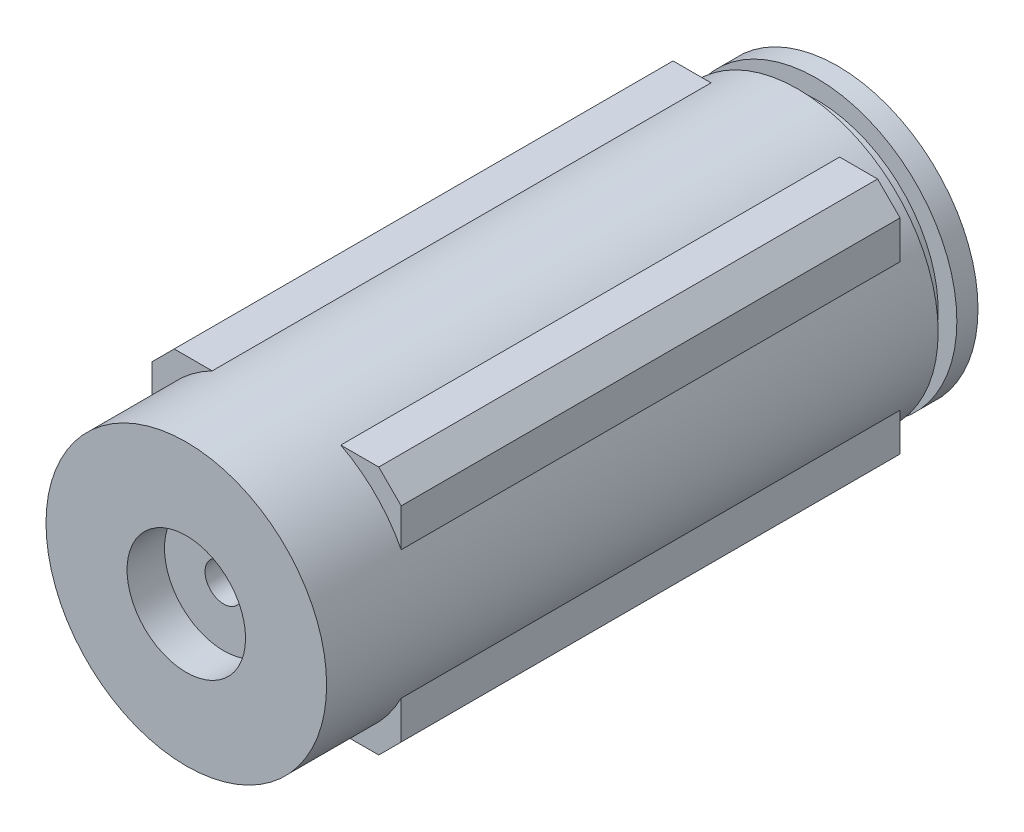
ISO-10303-21;
HEADER;
FILE_DESCRIPTION(('STEP AP214'),'2;1');
FILE_NAME('part.step','',(''),(''),'','','');
FILE_SCHEMA(('AUTOMOTIVE_DESIGN { 1 0 10303 214 1 1 1 1 }'));
ENDSEC;
DATA;
#1=APPLICATION_CONTEXT('core data for automotive mechanical design processes');
#2=APPLICATION_PROTOCOL_DEFINITION('international standard','automotive_design',2000,#1);
#3=PRODUCT_CONTEXT('',#1,'mechanical');
#4=PRODUCT('Part','Part','',(#3));
#5=PRODUCT_RELATED_PRODUCT_CATEGORY('part','',(#4));
#6=PRODUCT_DEFINITION_FORMATION('','',#4);
#7=PRODUCT_DEFINITION_CONTEXT('part definition',#1,'design');
#8=PRODUCT_DEFINITION('design','',#6,#7);
#9=PRODUCT_DEFINITION_SHAPE('','',#8);
#10=(LENGTH_UNIT() NAMED_UNIT(*) SI_UNIT(.MILLI.,.METRE.));
#11=(NAMED_UNIT(*) PLANE_ANGLE_UNIT() SI_UNIT($,.RADIAN.));
#12=(NAMED_UNIT(*) SI_UNIT($,.STERADIAN.) SOLID_ANGLE_UNIT());
#13=UNCERTAINTY_MEASURE_WITH_UNIT(LENGTH_MEASURE(1.E-05),#10,'distance_accuracy_value','');
#14=(GEOMETRIC_REPRESENTATION_CONTEXT(3) GLOBAL_UNCERTAINTY_ASSIGNED_CONTEXT((#13)) GLOBAL_UNIT_ASSIGNED_CONTEXT((#10,
#11,#12)) REPRESENTATION_CONTEXT('',''));
#15=CARTESIAN_POINT('',(0.,0.,0.));
#16=DIRECTION('',(0.,0.,1.));
#17=DIRECTION('',(1.,0.,0.));
#18=AXIS2_PLACEMENT_3D('',#15,#16,#17);
#19=CARTESIAN_POINT('',(0.,0.,90.));
#20=DIRECTION('',(0.,0.,-1.));
#21=DIRECTION('',(-1.,0.,0.));
#22=AXIS2_PLACEMENT_3D('',#19,#20,#21);
#23=CYLINDRICAL_SURFACE('',#22,3.);
#24=CARTESIAN_POINT('',(0.,0.,-4.));
#25=DIRECTION('',(0.,0.,-1.));
#26=DIRECTION('',(-1.,0.,0.));
#27=AXIS2_PLACEMENT_3D('',#24,#25,#26);
#28=CIRCLE('',#27,3.);
#29=CARTESIAN_POINT('',(-3.,0.,-4.));
#30=VERTEX_POINT('',#29);
#31=EDGE_CURVE('E229',#30,#30,#28,.F.);
#32=ORIENTED_EDGE('',*,*,#31,.F.);
#33=EDGE_LOOP('',(#32));
#34=FACE_BOUND('',#33,.T.);
#35=CARTESIAN_POINT('',(0.,0.,88.46));
#36=DIRECTION('',(0.,0.,1.));
#37=DIRECTION('',(1.,0.,0.));
#38=AXIS2_PLACEMENT_3D('',#35,#36,#37);
#39=CIRCLE('',#38,3.);
#40=CARTESIAN_POINT('',(3.,0.,88.46));
#41=VERTEX_POINT('',#40);
#42=EDGE_CURVE('E39',#41,#41,#39,.F.);
#43=ORIENTED_EDGE('',*,*,#42,.F.);
#44=EDGE_LOOP('',(#43));
#45=FACE_BOUND('',#44,.T.);
#46=ADVANCED_FACE('F35',(#34,#45),#23,.F.);
#47=CARTESIAN_POINT('',(0.,0.,80.));
#48=DIRECTION('',(0.,0.,-1.));
#49=DIRECTION('',(-1.,0.,0.));
#50=AXIS2_PLACEMENT_3D('',#47,#48,#49);
#51=CYLINDRICAL_SURFACE('',#50,22.5);
#52=DIRECTION('',(0.,0.,-1.));
#53=VECTOR('',#52,1.);
#54=CARTESIAN_POINT('',(-10.3077640640442,20.,80.));
#55=LINE('',#54,#53);
#56=CARTESIAN_POINT('',(-10.3077640640442,20.,80.));
#57=VERTEX_POINT('',#56);
#58=CARTESIAN_POINT('',(-10.3077640640442,20.,0.));
#59=VERTEX_POINT('',#58);
#60=EDGE_CURVE('E226',#57,#59,#55,.T.);
#61=ORIENTED_EDGE('',*,*,#60,.F.);
#62=CARTESIAN_POINT('',(0.,0.,80.));
#63=DIRECTION('',(0.,0.,1.));
#64=DIRECTION('',(1.,0.,0.));
#65=AXIS2_PLACEMENT_3D('',#62,#63,#64);
#66=CIRCLE('',#65,22.5);
#67=CARTESIAN_POINT('',(-20.,10.3077640640441,80.));
#68=VERTEX_POINT('',#67);
#69=EDGE_CURVE('E11',#57,#68,#66,.T.);
#70=ORIENTED_EDGE('',*,*,#69,.T.);
#71=DIRECTION('',(0.,0.,-1.));
#72=VECTOR('',#71,1.);
#73=CARTESIAN_POINT('',(-20.,10.3077640640441,80.));
#74=LINE('',#73,#72);
#75=CARTESIAN_POINT('',(-20.,10.3077640640441,0.));
#76=VERTEX_POINT('',#75);
#77=EDGE_CURVE('E218',#68,#76,#74,.T.);
#78=ORIENTED_EDGE('',*,*,#77,.T.);
#79=CARTESIAN_POINT('',(0.,0.,0.));
#80=DIRECTION('',(0.,0.,-1.));
#81=DIRECTION('',(-1.,0.,0.));
#82=AXIS2_PLACEMENT_3D('',#79,#80,#81);
#83=CIRCLE('',#82,22.5);
#84=EDGE_CURVE('E259',#76,#59,#83,.T.);
#85=ORIENTED_EDGE('',*,*,#84,.T.);
#86=EDGE_LOOP('',(#61,#70,#78,#85));
#87=FACE_BOUND('',#86,.T.);
#88=DIRECTION('',(0.,0.,-1.));
#89=VECTOR('',#88,1.);
#90=CARTESIAN_POINT('',(-20.,-10.3077640640442,80.));
#91=LINE('',#90,#89);
#92=CARTESIAN_POINT('',(-20.,-10.3077640640442,80.));
#93=VERTEX_POINT('',#92);
#94=CARTESIAN_POINT('',(-20.,-10.3077640640442,0.));
#95=VERTEX_POINT('',#94);
#96=EDGE_CURVE('E215',#93,#95,#91,.T.);
#97=ORIENTED_EDGE('',*,*,#96,.F.);
#98=CARTESIAN_POINT('',(-10.3077640640441,-20.,80.));
#99=VERTEX_POINT('',#98);
#100=EDGE_CURVE('E45',#93,#99,#66,.T.);
#101=ORIENTED_EDGE('',*,*,#100,.T.);
#102=DIRECTION('',(0.,0.,-1.));
#103=VECTOR('',#102,1.);
#104=CARTESIAN_POINT('',(-10.3077640640441,-20.,80.));
#105=LINE('',#104,#103);
#106=CARTESIAN_POINT('',(-10.3077640640442,-20.,0.));
#107=VERTEX_POINT('',#106);
#108=EDGE_CURVE('E206',#99,#107,#105,.T.);
#109=ORIENTED_EDGE('',*,*,#108,.T.);
#110=EDGE_CURVE('E228',#107,#95,#83,.T.);
#111=ORIENTED_EDGE('',*,*,#110,.T.);
#112=EDGE_LOOP('',(#97,#101,#109,#111));
#113=FACE_BOUND('',#112,.T.);
#114=DIRECTION('',(0.,0.,-1.));
#115=VECTOR('',#114,1.);
#116=CARTESIAN_POINT('',(10.3077640640441,-20.,80.));
#117=LINE('',#116,#115);
#118=CARTESIAN_POINT('',(10.3077640640441,-20.,80.));
#119=VERTEX_POINT('',#118);
#120=CARTESIAN_POINT('',(10.3077640640442,-20.,0.));
#121=VERTEX_POINT('',#120);
#122=EDGE_CURVE('E203',#119,#121,#117,.T.);
#123=ORIENTED_EDGE('',*,*,#122,.F.);
#124=CARTESIAN_POINT('',(20.,-10.3077640640442,80.));
#125=VERTEX_POINT('',#124);
#126=EDGE_CURVE('E261',#119,#125,#66,.T.);
#127=ORIENTED_EDGE('',*,*,#126,.T.);
#128=DIRECTION('',(0.,0.,-1.));
#129=VECTOR('',#128,1.);
#130=CARTESIAN_POINT('',(20.,-10.3077640640442,80.));
#131=LINE('',#130,#129);
#132=CARTESIAN_POINT('',(20.,-10.3077640640442,0.));
#133=VERTEX_POINT('',#132);
#134=EDGE_CURVE('E195',#125,#133,#131,.T.);
#135=ORIENTED_EDGE('',*,*,#134,.T.);
#136=EDGE_CURVE('E301',#133,#121,#83,.T.);
#137=ORIENTED_EDGE('',*,*,#136,.T.);
#138=EDGE_LOOP('',(#123,#127,#135,#137));
#139=FACE_BOUND('',#138,.T.);
#140=CARTESIAN_POINT('',(20.,10.3077640640442,80.));
#141=VERTEX_POINT('',#140);
#142=CARTESIAN_POINT('',(10.3077640640442,20.,80.));
#143=VERTEX_POINT('',#142);
#144=EDGE_CURVE('E47',#141,#143,#66,.T.);
#145=ORIENTED_EDGE('',*,*,#144,.T.);
#146=DIRECTION('',(0.,0.,-1.));
#147=VECTOR('',#146,1.);
#148=CARTESIAN_POINT('',(10.3077640640442,20.,80.));
#149=LINE('',#148,#147);
#150=CARTESIAN_POINT('',(10.3077640640442,20.,0.));
#151=VERTEX_POINT('',#150);
#152=EDGE_CURVE('E55',#143,#151,#149,.T.);
#153=ORIENTED_EDGE('',*,*,#152,.T.);
#154=CARTESIAN_POINT('',(20.,10.3077640640442,0.));
#155=VERTEX_POINT('',#154);
#156=EDGE_CURVE('E266',#151,#155,#83,.T.);
#157=ORIENTED_EDGE('',*,*,#156,.T.);
#158=DIRECTION('',(0.,0.,-1.));
#159=VECTOR('',#158,1.);
#160=CARTESIAN_POINT('',(20.,10.3077640640442,80.));
#161=LINE('',#160,#159);
#162=EDGE_CURVE('E145',#141,#155,#161,.T.);
#163=ORIENTED_EDGE('',*,*,#162,.F.);
#164=EDGE_LOOP('',(#145,#153,#157,#163));
#165=FACE_BOUND('',#164,.T.);
#166=CARTESIAN_POINT('',(0.,0.,94.46));
#167=DIRECTION('',(0.,0.,1.));
#168=DIRECTION('',(1.,0.,0.));
#169=AXIS2_PLACEMENT_3D('',#166,#167,#168);
#170=CIRCLE('',#169,22.5);
#171=CARTESIAN_POINT('',(22.5,0.,94.46));
#172=VERTEX_POINT('',#171);
#173=EDGE_CURVE('E257',#172,#172,#170,.T.);
#174=ORIENTED_EDGE('',*,*,#173,.F.);
#175=EDGE_LOOP('',(#174));
#176=FACE_BOUND('',#175,.T.);
#177=CARTESIAN_POINT('',(0.,0.,-3.61));
#178=DIRECTION('',(0.,0.,-1.));
#179=DIRECTION('',(-1.,0.,0.));
#180=AXIS2_PLACEMENT_3D('',#177,#178,#179);
#181=CIRCLE('',#180,22.5);
#182=CARTESIAN_POINT('',(-22.5,0.,-3.61));
#183=VERTEX_POINT('',#182);
#184=EDGE_CURVE('E252',#183,#183,#181,.T.);
#185=ORIENTED_EDGE('',*,*,#184,.F.);
#186=EDGE_LOOP('',(#185));
#187=FACE_BOUND('',#186,.T.);
#188=ADVANCED_FACE('F294',(#87,#113,#139,#165,#176,#187),#51,.T.);
#189=CARTESIAN_POINT('',(0.,0.,80.));
#190=DIRECTION('',(0.,0.,1.));
#191=DIRECTION('',(1.,0.,0.));
#192=AXIS2_PLACEMENT_3D('',#189,#190,#191);
#193=PLANE('',#192);
#194=ORIENTED_EDGE('',*,*,#144,.F.);
#195=DIRECTION('',(0.,-1.,0.));
#196=VECTOR('',#195,1.);
#197=CARTESIAN_POINT('',(20.,16.4,80.));
#198=LINE('',#197,#196);
#199=CARTESIAN_POINT('',(20.,16.4,80.));
#200=VERTEX_POINT('',#199);
#201=EDGE_CURVE('E140',#200,#141,#198,.T.);
#202=ORIENTED_EDGE('',*,*,#201,.F.);
#203=DIRECTION('',(0.707106781186548,-0.707106781186547,0.));
#204=VECTOR('',#203,1.);
#205=CARTESIAN_POINT('',(16.4,20.,80.));
#206=LINE('',#205,#204);
#207=CARTESIAN_POINT('',(16.4,20.,80.));
#208=VERTEX_POINT('',#207);
#209=EDGE_CURVE('E151',#208,#200,#206,.T.);
#210=ORIENTED_EDGE('',*,*,#209,.F.);
#211=DIRECTION('',(1.,0.,0.));
#212=VECTOR('',#211,1.);
#213=CARTESIAN_POINT('',(10.3077640640442,20.,80.));
#214=LINE('',#213,#212);
#215=EDGE_CURVE('E156',#143,#208,#214,.T.);
#216=ORIENTED_EDGE('',*,*,#215,.F.);
#217=EDGE_LOOP('',(#194,#202,#210,#216));
#218=FACE_BOUND('',#217,.T.);
#219=ADVANCED_FACE('F150',(#218),#193,.T.);
#220=ORIENTED_EDGE('',*,*,#69,.F.);
#221=DIRECTION('',(1.,0.,0.));
#222=VECTOR('',#221,1.);
#223=CARTESIAN_POINT('',(-16.4,20.,80.));
#224=LINE('',#223,#222);
#225=CARTESIAN_POINT('',(-16.4,20.,80.));
#226=VERTEX_POINT('',#225);
#227=EDGE_CURVE('E191',#226,#57,#224,.T.);
#228=ORIENTED_EDGE('',*,*,#227,.F.);
#229=DIRECTION('',(-0.707106781186547,-0.707106781186548,0.));
#230=VECTOR('',#229,1.);
#231=CARTESIAN_POINT('',(-16.4,20.,80.));
#232=LINE('',#231,#230);
#233=CARTESIAN_POINT('',(-20.,16.4,80.));
#234=VERTEX_POINT('',#233);
#235=EDGE_CURVE('E269',#226,#234,#232,.T.);
#236=ORIENTED_EDGE('',*,*,#235,.T.);
#237=DIRECTION('',(0.,-1.,0.));
#238=VECTOR('',#237,1.);
#239=CARTESIAN_POINT('',(-20.,16.4,80.));
#240=LINE('',#239,#238);
#241=EDGE_CURVE('E271',#234,#68,#240,.T.);
#242=ORIENTED_EDGE('',*,*,#241,.T.);
#243=EDGE_LOOP('',(#220,#228,#236,#242));
#244=FACE_BOUND('',#243,.T.);
#245=ADVANCED_FACE('F330',(#244),#193,.T.);
#246=ORIENTED_EDGE('',*,*,#100,.F.);
#247=DIRECTION('',(0.,-1.,0.));
#248=VECTOR('',#247,1.);
#249=CARTESIAN_POINT('',(-20.,-10.3077640640442,80.));
#250=LINE('',#249,#248);
#251=CARTESIAN_POINT('',(-20.,-16.4,80.));
#252=VERTEX_POINT('',#251);
#253=EDGE_CURVE('E273',#93,#252,#250,.T.);
#254=ORIENTED_EDGE('',*,*,#253,.T.);
#255=DIRECTION('',(0.707106781186548,-0.707106781186547,0.));
#256=VECTOR('',#255,1.);
#257=CARTESIAN_POINT('',(-20.,-16.4,80.));
#258=LINE('',#257,#256);
#259=CARTESIAN_POINT('',(-16.4,-20.,80.));
#260=VERTEX_POINT('',#259);
#261=EDGE_CURVE('E275',#252,#260,#258,.T.);
#262=ORIENTED_EDGE('',*,*,#261,.T.);
#263=DIRECTION('',(1.,0.,0.));
#264=VECTOR('',#263,1.);
#265=CARTESIAN_POINT('',(-16.4,-20.,80.));
#266=LINE('',#265,#264);
#267=EDGE_CURVE('E277',#260,#99,#266,.T.);
#268=ORIENTED_EDGE('',*,*,#267,.T.);
#269=EDGE_LOOP('',(#246,#254,#262,#268));
#270=FACE_BOUND('',#269,.T.);
#271=ADVANCED_FACE('F327',(#270),#193,.T.);
#272=CARTESIAN_POINT('',(0.,0.,0.));
#273=DIRECTION('',(0.,0.,1.));
#274=DIRECTION('',(1.,0.,0.));
#275=AXIS2_PLACEMENT_3D('',#272,#273,#274);
#276=PLANE('',#275);
#277=ORIENTED_EDGE('',*,*,#84,.F.);
#278=DIRECTION('',(0.,-1.,0.));
#279=VECTOR('',#278,1.);
#280=CARTESIAN_POINT('',(-20.,16.4,0.));
#281=LINE('',#280,#279);
#282=CARTESIAN_POINT('',(-20.,16.4,0.));
#283=VERTEX_POINT('',#282);
#284=EDGE_CURVE('E167',#283,#76,#281,.T.);
#285=ORIENTED_EDGE('',*,*,#284,.F.);
#286=DIRECTION('',(-0.707106781186547,-0.707106781186548,0.));
#287=VECTOR('',#286,1.);
#288=CARTESIAN_POINT('',(-16.4,20.,0.));
#289=LINE('',#288,#287);
#290=CARTESIAN_POINT('',(-16.4,20.,0.));
#291=VERTEX_POINT('',#290);
#292=EDGE_CURVE('E164',#291,#283,#289,.T.);
#293=ORIENTED_EDGE('',*,*,#292,.F.);
#294=DIRECTION('',(1.,0.,0.));
#295=VECTOR('',#294,1.);
#296=CARTESIAN_POINT('',(-16.4,20.,0.));
#297=LINE('',#296,#295);
#298=EDGE_CURVE('E161',#291,#59,#297,.T.);
#299=ORIENTED_EDGE('',*,*,#298,.T.);
#300=EDGE_LOOP('',(#277,#285,#293,#299));
#301=FACE_BOUND('',#300,.T.);
#302=ADVANCED_FACE('F329',(#301),#276,.F.);
#303=ORIENTED_EDGE('',*,*,#156,.F.);
#304=DIRECTION('',(1.,0.,0.));
#305=VECTOR('',#304,1.);
#306=CARTESIAN_POINT('',(10.3077640640442,20.,0.));
#307=LINE('',#306,#305);
#308=CARTESIAN_POINT('',(16.4,20.,0.));
#309=VERTEX_POINT('',#308);
#310=EDGE_CURVE('E188',#151,#309,#307,.T.);
#311=ORIENTED_EDGE('',*,*,#310,.T.);
#312=DIRECTION('',(0.707106781186548,-0.707106781186547,0.));
#313=VECTOR('',#312,1.);
#314=CARTESIAN_POINT('',(16.4,20.,0.));
#315=LINE('',#314,#313);
#316=CARTESIAN_POINT('',(20.,16.4,0.));
#317=VERTEX_POINT('',#316);
#318=EDGE_CURVE('E186',#309,#317,#315,.T.);
#319=ORIENTED_EDGE('',*,*,#318,.T.);
#320=DIRECTION('',(0.,-1.,0.));
#321=VECTOR('',#320,1.);
#322=CARTESIAN_POINT('',(20.,16.4,0.));
#323=LINE('',#322,#321);
#324=EDGE_CURVE('E143',#317,#155,#323,.T.);
#325=ORIENTED_EDGE('',*,*,#324,.T.);
#326=EDGE_LOOP('',(#303,#311,#319,#325));
#327=FACE_BOUND('',#326,.T.);
#328=ADVANCED_FACE('F336',(#327),#276,.F.);
#329=ORIENTED_EDGE('',*,*,#136,.F.);
#330=DIRECTION('',(0.,-1.,0.));
#331=VECTOR('',#330,1.);
#332=CARTESIAN_POINT('',(20.,-10.3077640640442,0.));
#333=LINE('',#332,#331);
#334=CARTESIAN_POINT('',(20.,-16.4,0.));
#335=VERTEX_POINT('',#334);
#336=EDGE_CURVE('E182',#133,#335,#333,.T.);
#337=ORIENTED_EDGE('',*,*,#336,.T.);
#338=DIRECTION('',(0.707106781186548,0.707106781186547,0.));
#339=VECTOR('',#338,1.);
#340=CARTESIAN_POINT('',(16.4,-20.,0.));
#341=LINE('',#340,#339);
#342=CARTESIAN_POINT('',(16.4,-20.,0.));
#343=VERTEX_POINT('',#342);
#344=EDGE_CURVE('E179',#343,#335,#341,.T.);
#345=ORIENTED_EDGE('',*,*,#344,.F.);
#346=DIRECTION('',(1.,0.,0.));
#347=VECTOR('',#346,1.);
#348=CARTESIAN_POINT('',(10.3077640640441,-20.,0.));
#349=LINE('',#348,#347);
#350=EDGE_CURVE('E177',#121,#343,#349,.T.);
#351=ORIENTED_EDGE('',*,*,#350,.F.);
#352=EDGE_LOOP('',(#329,#337,#345,#351));
#353=FACE_BOUND('',#352,.T.);
#354=ADVANCED_FACE('F586',(#353),#276,.F.);
#355=ORIENTED_EDGE('',*,*,#110,.F.);
#356=DIRECTION('',(1.,0.,0.));
#357=VECTOR('',#356,1.);
#358=CARTESIAN_POINT('',(-16.4,-20.,0.));
#359=LINE('',#358,#357);
#360=CARTESIAN_POINT('',(-16.4,-20.,0.));
#361=VERTEX_POINT('',#360);
#362=EDGE_CURVE('E174',#361,#107,#359,.T.);
#363=ORIENTED_EDGE('',*,*,#362,.F.);
#364=DIRECTION('',(0.707106781186548,-0.707106781186547,0.));
#365=VECTOR('',#364,1.);
#366=CARTESIAN_POINT('',(-20.,-16.4,0.));
#367=LINE('',#366,#365);
#368=CARTESIAN_POINT('',(-20.,-16.4,0.));
#369=VERTEX_POINT('',#368);
#370=EDGE_CURVE('E172',#369,#361,#367,.T.);
#371=ORIENTED_EDGE('',*,*,#370,.F.);
#372=DIRECTION('',(0.,-1.,0.));
#373=VECTOR('',#372,1.);
#374=CARTESIAN_POINT('',(-20.,-10.3077640640442,0.));
#375=LINE('',#374,#373);
#376=EDGE_CURVE('E170',#95,#369,#375,.T.);
#377=ORIENTED_EDGE('',*,*,#376,.F.);
#378=EDGE_LOOP('',(#355,#363,#371,#377));
#379=FACE_BOUND('',#378,.T.);
#380=ADVANCED_FACE('F318',(#379),#276,.F.);
#381=CARTESIAN_POINT('',(-16.4,20.,80.));
#382=DIRECTION('',(0.,1.,0.));
#383=DIRECTION('',(0.,0.,1.));
#384=AXIS2_PLACEMENT_3D('',#381,#382,#383);
#385=PLANE('',#384);
#386=ORIENTED_EDGE('',*,*,#298,.F.);
#387=DIRECTION('',(0.,0.,-1.));
#388=VECTOR('',#387,1.);
#389=CARTESIAN_POINT('',(-16.4,20.,80.));
#390=LINE('',#389,#388);
#391=EDGE_CURVE('E224',#226,#291,#390,.T.);
#392=ORIENTED_EDGE('',*,*,#391,.F.);
#393=ORIENTED_EDGE('',*,*,#227,.T.);
#394=ORIENTED_EDGE('',*,*,#60,.T.);
#395=EDGE_LOOP('',(#386,#392,#393,#394));
#396=FACE_BOUND('',#395,.T.);
#397=ADVANCED_FACE('F37',(#396),#385,.T.);
#398=CARTESIAN_POINT('',(-16.4,20.,80.));
#399=DIRECTION('',(0.707106781186548,-0.707106781186547,0.));
#400=DIRECTION('',(0.707106781186547,0.707106781186548,0.));
#401=AXIS2_PLACEMENT_3D('',#398,#399,#400);
#402=PLANE('',#401);
#403=ORIENTED_EDGE('',*,*,#292,.T.);
#404=DIRECTION('',(0.,0.,-1.));
#405=VECTOR('',#404,1.);
#406=CARTESIAN_POINT('',(-20.,16.4,80.));
#407=LINE('',#406,#405);
#408=EDGE_CURVE('E221',#234,#283,#407,.T.);
#409=ORIENTED_EDGE('',*,*,#408,.F.);
#410=ORIENTED_EDGE('',*,*,#235,.F.);
#411=ORIENTED_EDGE('',*,*,#391,.T.);
#412=EDGE_LOOP('',(#403,#409,#410,#411));
#413=FACE_BOUND('',#412,.T.);
#414=ADVANCED_FACE('F546',(#413),#402,.F.);
#415=CARTESIAN_POINT('',(-20.,16.4,80.));
#416=DIRECTION('',(1.,0.,0.));
#417=DIRECTION('',(0.,1.,0.));
#418=AXIS2_PLACEMENT_3D('',#415,#416,#417);
#419=PLANE('',#418);
#420=ORIENTED_EDGE('',*,*,#284,.T.);
#421=ORIENTED_EDGE('',*,*,#77,.F.);
#422=ORIENTED_EDGE('',*,*,#241,.F.);
#423=ORIENTED_EDGE('',*,*,#408,.T.);
#424=EDGE_LOOP('',(#420,#421,#422,#423));
#425=FACE_BOUND('',#424,.T.);
#426=ADVANCED_FACE('F537',(#425),#419,.F.);
#427=CARTESIAN_POINT('',(-20.,-10.3077640640442,80.));
#428=DIRECTION('',(1.,0.,0.));
#429=DIRECTION('',(0.,1.,0.));
#430=AXIS2_PLACEMENT_3D('',#427,#428,#429);
#431=PLANE('',#430);
#432=ORIENTED_EDGE('',*,*,#376,.T.);
#433=DIRECTION('',(0.,0.,-1.));
#434=VECTOR('',#433,1.);
#435=CARTESIAN_POINT('',(-20.,-16.4,80.));
#436=LINE('',#435,#434);
#437=EDGE_CURVE('E212',#252,#369,#436,.T.);
#438=ORIENTED_EDGE('',*,*,#437,.F.);
#439=ORIENTED_EDGE('',*,*,#253,.F.);
#440=ORIENTED_EDGE('',*,*,#96,.T.);
#441=EDGE_LOOP('',(#432,#438,#439,#440));
#442=FACE_BOUND('',#441,.T.);
#443=ADVANCED_FACE('F315',(#442),#431,.F.);
#444=CARTESIAN_POINT('',(-20.,-16.4,80.));
#445=DIRECTION('',(0.707106781186547,0.707106781186548,0.));
#446=DIRECTION('',(-0.707106781186548,0.707106781186547,0.));
#447=AXIS2_PLACEMENT_3D('',#444,#445,#446);
#448=PLANE('',#447);
#449=ORIENTED_EDGE('',*,*,#370,.T.);
#450=DIRECTION('',(0.,0.,-1.));
#451=VECTOR('',#450,1.);
#452=CARTESIAN_POINT('',(-16.4,-20.,80.));
#453=LINE('',#452,#451);
#454=EDGE_CURVE('E209',#260,#361,#453,.T.);
#455=ORIENTED_EDGE('',*,*,#454,.F.);
#456=ORIENTED_EDGE('',*,*,#261,.F.);
#457=ORIENTED_EDGE('',*,*,#437,.T.);
#458=EDGE_LOOP('',(#449,#455,#456,#457));
#459=FACE_BOUND('',#458,.T.);
#460=ADVANCED_FACE('F321',(#459),#448,.F.);
#461=CARTESIAN_POINT('',(-16.4,-20.,80.));
#462=DIRECTION('',(0.,1.,0.));
#463=DIRECTION('',(0.,0.,1.));
#464=AXIS2_PLACEMENT_3D('',#461,#462,#463);
#465=PLANE('',#464);
#466=ORIENTED_EDGE('',*,*,#362,.T.);
#467=ORIENTED_EDGE('',*,*,#108,.F.);
#468=ORIENTED_EDGE('',*,*,#267,.F.);
#469=ORIENTED_EDGE('',*,*,#454,.T.);
#470=EDGE_LOOP('',(#466,#467,#468,#469));
#471=FACE_BOUND('',#470,.T.);
#472=ADVANCED_FACE('F325',(#471),#465,.F.);
#473=CARTESIAN_POINT('',(10.3077640640441,-20.,80.));
#474=DIRECTION('',(0.,1.,0.));
#475=DIRECTION('',(0.,0.,1.));
#476=AXIS2_PLACEMENT_3D('',#473,#474,#475);
#477=PLANE('',#476);
#478=ORIENTED_EDGE('',*,*,#350,.T.);
#479=DIRECTION('',(0.,0.,-1.));
#480=VECTOR('',#479,1.);
#481=CARTESIAN_POINT('',(16.4,-20.,80.));
#482=LINE('',#481,#480);
#483=CARTESIAN_POINT('',(16.4,-20.,80.));
#484=VERTEX_POINT('',#483);
#485=EDGE_CURVE('E200',#484,#343,#482,.T.);
#486=ORIENTED_EDGE('',*,*,#485,.F.);
#487=DIRECTION('',(1.,0.,0.));
#488=VECTOR('',#487,1.);
#489=CARTESIAN_POINT('',(10.3077640640441,-20.,80.));
#490=LINE('',#489,#488);
#491=EDGE_CURVE('E279',#119,#484,#490,.T.);
#492=ORIENTED_EDGE('',*,*,#491,.F.);
#493=ORIENTED_EDGE('',*,*,#122,.T.);
#494=EDGE_LOOP('',(#478,#486,#492,#493));
#495=FACE_BOUND('',#494,.T.);
#496=ADVANCED_FACE('F513',(#495),#477,.F.);
#497=CARTESIAN_POINT('',(16.4,-20.,80.));
#498=DIRECTION('',(-0.707106781186547,0.707106781186548,0.));
#499=DIRECTION('',(-0.707106781186548,-0.707106781186547,0.));
#500=AXIS2_PLACEMENT_3D('',#497,#498,#499);
#501=PLANE('',#500);
#502=ORIENTED_EDGE('',*,*,#344,.T.);
#503=DIRECTION('',(0.,0.,-1.));
#504=VECTOR('',#503,1.);
#505=CARTESIAN_POINT('',(20.,-16.4,80.));
#506=LINE('',#505,#504);
#507=CARTESIAN_POINT('',(20.,-16.4,80.));
#508=VERTEX_POINT('',#507);
#509=EDGE_CURVE('E198',#508,#335,#506,.T.);
#510=ORIENTED_EDGE('',*,*,#509,.F.);
#511=DIRECTION('',(0.707106781186548,0.707106781186547,0.));
#512=VECTOR('',#511,1.);
#513=CARTESIAN_POINT('',(16.4,-20.,80.));
#514=LINE('',#513,#512);
#515=EDGE_CURVE('E281',#484,#508,#514,.T.);
#516=ORIENTED_EDGE('',*,*,#515,.F.);
#517=ORIENTED_EDGE('',*,*,#485,.T.);
#518=EDGE_LOOP('',(#502,#510,#516,#517));
#519=FACE_BOUND('',#518,.T.);
#520=ADVANCED_FACE('F504',(#519),#501,.F.);
#521=CARTESIAN_POINT('',(20.,-10.3077640640442,80.));
#522=DIRECTION('',(1.,0.,0.));
#523=DIRECTION('',(0.,1.,0.));
#524=AXIS2_PLACEMENT_3D('',#521,#522,#523);
#525=PLANE('',#524);
#526=ORIENTED_EDGE('',*,*,#336,.F.);
#527=ORIENTED_EDGE('',*,*,#134,.F.);
#528=DIRECTION('',(0.,-1.,0.));
#529=VECTOR('',#528,1.);
#530=CARTESIAN_POINT('',(20.,-10.3077640640442,80.));
#531=LINE('',#530,#529);
#532=EDGE_CURVE('E153',#125,#508,#531,.T.);
#533=ORIENTED_EDGE('',*,*,#532,.T.);
#534=ORIENTED_EDGE('',*,*,#509,.T.);
#535=EDGE_LOOP('',(#526,#527,#533,#534));
#536=FACE_BOUND('',#535,.T.);
#537=ADVANCED_FACE('F286',(#536),#525,.T.);
#538=CARTESIAN_POINT('',(20.,16.4,80.));
#539=DIRECTION('',(1.,0.,0.));
#540=DIRECTION('',(0.,1.,0.));
#541=AXIS2_PLACEMENT_3D('',#538,#539,#540);
#542=PLANE('',#541);
#543=ORIENTED_EDGE('',*,*,#324,.F.);
#544=DIRECTION('',(0.,0.,-1.));
#545=VECTOR('',#544,1.);
#546=CARTESIAN_POINT('',(20.,16.4,80.));
#547=LINE('',#546,#545);
#548=EDGE_CURVE('E89',#200,#317,#547,.T.);
#549=ORIENTED_EDGE('',*,*,#548,.F.);
#550=ORIENTED_EDGE('',*,*,#201,.T.);
#551=ORIENTED_EDGE('',*,*,#162,.T.);
#552=EDGE_LOOP('',(#543,#549,#550,#551));
#553=FACE_BOUND('',#552,.T.);
#554=ADVANCED_FACE('F137',(#553),#542,.T.);
#555=CARTESIAN_POINT('',(16.4,20.,80.));
#556=DIRECTION('',(0.707106781186547,0.707106781186548,0.));
#557=DIRECTION('',(-0.707106781186548,0.707106781186547,0.));
#558=AXIS2_PLACEMENT_3D('',#555,#556,#557);
#559=PLANE('',#558);
#560=ORIENTED_EDGE('',*,*,#318,.F.);
#561=DIRECTION('',(0.,0.,-1.));
#562=VECTOR('',#561,1.);
#563=CARTESIAN_POINT('',(16.4,20.,80.));
#564=LINE('',#563,#562);
#565=EDGE_CURVE('E93',#208,#309,#564,.T.);
#566=ORIENTED_EDGE('',*,*,#565,.F.);
#567=ORIENTED_EDGE('',*,*,#209,.T.);
#568=ORIENTED_EDGE('',*,*,#548,.T.);
#569=EDGE_LOOP('',(#560,#566,#567,#568));
#570=FACE_BOUND('',#569,.T.);
#571=ADVANCED_FACE('F155',(#570),#559,.T.);
#572=CARTESIAN_POINT('',(10.3077640640442,20.,80.));
#573=DIRECTION('',(0.,1.,0.));
#574=DIRECTION('',(0.,0.,1.));
#575=AXIS2_PLACEMENT_3D('',#572,#573,#574);
#576=PLANE('',#575);
#577=ORIENTED_EDGE('',*,*,#310,.F.);
#578=ORIENTED_EDGE('',*,*,#152,.F.);
#579=ORIENTED_EDGE('',*,*,#215,.T.);
#580=ORIENTED_EDGE('',*,*,#565,.T.);
#581=EDGE_LOOP('',(#577,#578,#579,#580));
#582=FACE_BOUND('',#581,.T.);
#583=ADVANCED_FACE('F342',(#582),#576,.T.);
#584=ORIENTED_EDGE('',*,*,#126,.F.);
#585=ORIENTED_EDGE('',*,*,#491,.T.);
#586=ORIENTED_EDGE('',*,*,#515,.T.);
#587=ORIENTED_EDGE('',*,*,#532,.F.);
#588=EDGE_LOOP('',(#584,#585,#586,#587));
#589=FACE_BOUND('',#588,.T.);
#590=ADVANCED_FACE('F290',(#589),#193,.T.);
#591=CARTESIAN_POINT('',(0.,0.,94.46));
#592=DIRECTION('',(0.,0.,1.));
#593=DIRECTION('',(1.,0.,0.));
#594=AXIS2_PLACEMENT_3D('',#591,#592,#593);
#595=PLANE('',#594);
#596=CARTESIAN_POINT('',(0.,0.,94.46));
#597=DIRECTION('',(0.,0.,1.));
#598=DIRECTION('',(1.,0.,0.));
#599=AXIS2_PLACEMENT_3D('',#596,#597,#598);
#600=CIRCLE('',#599,9.5);
#601=CARTESIAN_POINT('',(9.5,0.,94.46));
#602=VERTEX_POINT('',#601);
#603=EDGE_CURVE('E246',#602,#602,#600,.T.);
#604=ORIENTED_EDGE('',*,*,#603,.F.);
#605=EDGE_LOOP('',(#604));
#606=FACE_BOUND('',#605,.T.);
#607=ORIENTED_EDGE('',*,*,#173,.T.);
#608=EDGE_LOOP('',(#607));
#609=FACE_BOUND('',#608,.T.);
#610=ADVANCED_FACE('F341',(#606,#609),#595,.T.);
#611=CARTESIAN_POINT('',(0.,0.,-3.61));
#612=DIRECTION('',(0.,0.,-1.));
#613=DIRECTION('',(-1.,0.,0.));
#614=AXIS2_PLACEMENT_3D('',#611,#612,#613);
#615=CYLINDRICAL_SURFACE('',#614,19.5);
#616=CARTESIAN_POINT('',(0.,0.,-3.61));
#617=DIRECTION('',(0.,0.,-1.));
#618=DIRECTION('',(-1.,0.,0.));
#619=AXIS2_PLACEMENT_3D('',#616,#617,#618);
#620=CIRCLE('',#619,19.5);
#621=CARTESIAN_POINT('',(-19.5,0.,-3.61));
#622=VERTEX_POINT('',#621);
#623=EDGE_CURVE('E249',#622,#622,#620,.T.);
#624=ORIENTED_EDGE('',*,*,#623,.T.);
#625=EDGE_LOOP('',(#624));
#626=FACE_BOUND('',#625,.T.);
#627=CARTESIAN_POINT('',(0.,0.,-6.61));
#628=DIRECTION('',(0.,0.,-1.));
#629=DIRECTION('',(-1.,0.,0.));
#630=AXIS2_PLACEMENT_3D('',#627,#628,#629);
#631=CIRCLE('',#630,19.5);
#632=CARTESIAN_POINT('',(-19.5,0.,-6.61));
#633=VERTEX_POINT('',#632);
#634=EDGE_CURVE('E231',#633,#633,#631,.T.);
#635=ORIENTED_EDGE('',*,*,#634,.F.);
#636=EDGE_LOOP('',(#635));
#637=FACE_BOUND('',#636,.T.);
#638=ADVANCED_FACE('F361',(#626,#637),#615,.T.);
#639=CARTESIAN_POINT('',(0.,0.,-3.61));
#640=DIRECTION('',(0.,0.,-1.));
#641=DIRECTION('',(-1.,0.,0.));
#642=AXIS2_PLACEMENT_3D('',#639,#640,#641);
#643=PLANE('',#642);
#644=ORIENTED_EDGE('',*,*,#623,.F.);
#645=EDGE_LOOP('',(#644));
#646=FACE_BOUND('',#645,.T.);
#647=ORIENTED_EDGE('',*,*,#184,.T.);
#648=EDGE_LOOP('',(#647));
#649=FACE_BOUND('',#648,.T.);
#650=ADVANCED_FACE('F357',(#646,#649),#643,.T.);
#651=CARTESIAN_POINT('',(0.,0.,-6.61));
#652=DIRECTION('',(0.,0.,-1.));
#653=DIRECTION('',(-1.,0.,0.));
#654=AXIS2_PLACEMENT_3D('',#651,#652,#653);
#655=PLANE('',#654);
#656=ORIENTED_EDGE('',*,*,#634,.T.);
#657=EDGE_LOOP('',(#656));
#658=FACE_BOUND('',#657,.T.);
#659=CARTESIAN_POINT('',(0.,0.,-6.61));
#660=DIRECTION('',(0.,0.,-1.));
#661=DIRECTION('',(-1.,0.,0.));
#662=AXIS2_PLACEMENT_3D('',#659,#660,#661);
#663=CIRCLE('',#662,22.5);
#664=CARTESIAN_POINT('',(-22.5,0.,-6.61));
#665=VERTEX_POINT('',#664);
#666=EDGE_CURVE('E236',#665,#665,#663,.T.);
#667=ORIENTED_EDGE('',*,*,#666,.F.);
#668=EDGE_LOOP('',(#667));
#669=FACE_BOUND('',#668,.T.);
#670=ADVANCED_FACE('F360',(#658,#669),#655,.F.);
#671=CARTESIAN_POINT('',(0.,0.,-10.));
#672=DIRECTION('',(0.,0.,-1.));
#673=DIRECTION('',(-1.,0.,0.));
#674=AXIS2_PLACEMENT_3D('',#671,#672,#673);
#675=PLANE('',#674);
#676=CARTESIAN_POINT('',(0.,0.,-10.));
#677=DIRECTION('',(0.,0.,-1.));
#678=DIRECTION('',(-1.,0.,0.));
#679=AXIS2_PLACEMENT_3D('',#676,#677,#678);
#680=CIRCLE('',#679,9.5);
#681=CARTESIAN_POINT('',(-9.5,0.,-10.));
#682=VERTEX_POINT('',#681);
#683=EDGE_CURVE('E239',#682,#682,#680,.T.);
#684=ORIENTED_EDGE('',*,*,#683,.F.);
#685=EDGE_LOOP('',(#684));
#686=FACE_BOUND('',#685,.T.);
#687=CARTESIAN_POINT('',(0.,0.,-10.));
#688=DIRECTION('',(0.,0.,-1.));
#689=DIRECTION('',(-1.,0.,0.));
#690=AXIS2_PLACEMENT_3D('',#687,#688,#689);
#691=CIRCLE('',#690,22.5);
#692=CARTESIAN_POINT('',(-22.5,0.,-10.));
#693=VERTEX_POINT('',#692);
#694=EDGE_CURVE('E165',#693,#693,#691,.T.);
#695=ORIENTED_EDGE('',*,*,#694,.T.);
#696=EDGE_LOOP('',(#695));
#697=FACE_BOUND('',#696,.T.);
#698=ADVANCED_FACE('F365',(#686,#697),#675,.T.);
#699=ORIENTED_EDGE('',*,*,#666,.T.);
#700=EDGE_LOOP('',(#699));
#701=FACE_BOUND('',#700,.T.);
#702=ORIENTED_EDGE('',*,*,#694,.F.);
#703=EDGE_LOOP('',(#702));
#704=FACE_BOUND('',#703,.T.);
#705=ADVANCED_FACE('F351',(#701,#704),#51,.T.);
#706=CARTESIAN_POINT('',(0.,0.,-4.));
#707=DIRECTION('',(0.,0.,-1.));
#708=DIRECTION('',(-1.,0.,0.));
#709=AXIS2_PLACEMENT_3D('',#706,#707,#708);
#710=PLANE('',#709);
#711=CARTESIAN_POINT('',(0.,0.,-4.));
#712=DIRECTION('',(0.,0.,-1.));
#713=DIRECTION('',(-1.,0.,0.));
#714=AXIS2_PLACEMENT_3D('',#711,#712,#713);
#715=CIRCLE('',#714,9.5);
#716=CARTESIAN_POINT('',(-9.5,0.,-4.));
#717=VERTEX_POINT('',#716);
#718=EDGE_CURVE('E232',#717,#717,#715,.T.);
#719=ORIENTED_EDGE('',*,*,#718,.T.);
#720=EDGE_LOOP('',(#719));
#721=FACE_BOUND('',#720,.T.);
#722=ORIENTED_EDGE('',*,*,#31,.T.);
#723=EDGE_LOOP('',(#722));
#724=FACE_BOUND('',#723,.T.);
#725=ADVANCED_FACE('F377',(#721,#724),#710,.T.);
#726=CARTESIAN_POINT('',(0.,0.,-4.));
#727=DIRECTION('',(0.,0.,-1.));
#728=DIRECTION('',(-1.,0.,0.));
#729=AXIS2_PLACEMENT_3D('',#726,#727,#728);
#730=CYLINDRICAL_SURFACE('',#729,9.5);
#731=ORIENTED_EDGE('',*,*,#718,.F.);
#732=EDGE_LOOP('',(#731));
#733=FACE_BOUND('',#732,.T.);
#734=ORIENTED_EDGE('',*,*,#683,.T.);
#735=EDGE_LOOP('',(#734));
#736=FACE_BOUND('',#735,.T.);
#737=ADVANCED_FACE('F355',(#733,#736),#730,.F.);
#738=CARTESIAN_POINT('',(0.,0.,88.46));
#739=DIRECTION('',(0.,0.,1.));
#740=DIRECTION('',(1.,0.,0.));
#741=AXIS2_PLACEMENT_3D('',#738,#739,#740);
#742=PLANE('',#741);
#743=CARTESIAN_POINT('',(0.,0.,88.46));
#744=DIRECTION('',(0.,0.,1.));
#745=DIRECTION('',(1.,0.,0.));
#746=AXIS2_PLACEMENT_3D('',#743,#744,#745);
#747=CIRCLE('',#746,9.5);
#748=CARTESIAN_POINT('',(9.5,0.,88.46));
#749=VERTEX_POINT('',#748);
#750=EDGE_CURVE('E404',#749,#749,#747,.T.);
#751=ORIENTED_EDGE('',*,*,#750,.T.);
#752=EDGE_LOOP('',(#751));
#753=FACE_BOUND('',#752,.T.);
#754=ORIENTED_EDGE('',*,*,#42,.T.);
#755=EDGE_LOOP('',(#754));
#756=FACE_BOUND('',#755,.T.);
#757=ADVANCED_FACE('F385',(#753,#756),#742,.T.);
#758=CARTESIAN_POINT('',(0.,0.,88.46));
#759=DIRECTION('',(0.,0.,1.));
#760=DIRECTION('',(1.,0.,0.));
#761=AXIS2_PLACEMENT_3D('',#758,#759,#760);
#762=CYLINDRICAL_SURFACE('',#761,9.5);
#763=ORIENTED_EDGE('',*,*,#750,.F.);
#764=EDGE_LOOP('',(#763));
#765=FACE_BOUND('',#764,.T.);
#766=ORIENTED_EDGE('',*,*,#603,.T.);
#767=EDGE_LOOP('',(#766));
#768=FACE_BOUND('',#767,.T.);
#769=ADVANCED_FACE('F391',(#765,#768),#762,.F.);
#770=CLOSED_SHELL('',(#46,#188,#219,#245,#271,#302,#328,#354,#380,#397,#414,#426,#443,#460,#472,
#496,#520,#537,#554,#571,#583,#590,#610,#638,#650,#670,#698,#705,#725,#737,#757,#769));
#771=MANIFOLD_SOLID_BREP('B2',#770);
#772=ADVANCED_BREP_SHAPE_REPRESENTATION('',(#18,#771),#14);
#773=SHAPE_DEFINITION_REPRESENTATION(#9,#772);
ENDSEC;
END-ISO-10303-21;
